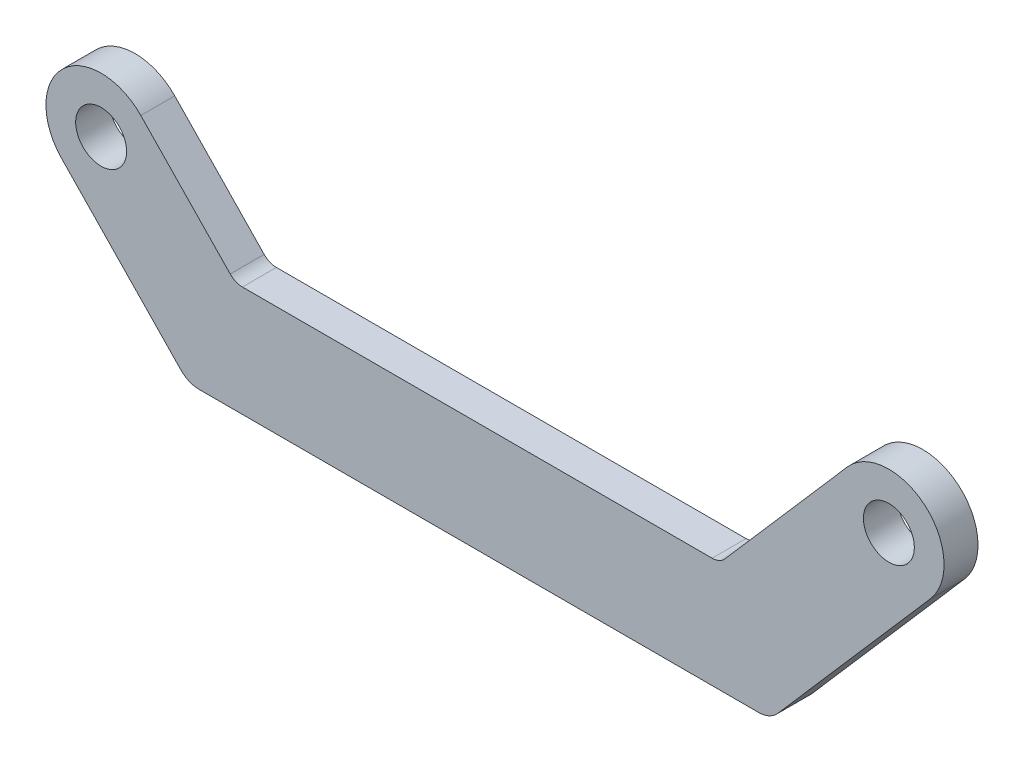
ISO-10303-21;
HEADER;
FILE_DESCRIPTION(('STEP AP214'),'2;1');
FILE_NAME('part.step','',(''),(''),'','','');
FILE_SCHEMA(('AUTOMOTIVE_DESIGN { 1 0 10303 214 1 1 1 1 }'));
ENDSEC;
DATA;
#1=APPLICATION_CONTEXT('core data for automotive mechanical design processes');
#2=APPLICATION_PROTOCOL_DEFINITION('international standard','automotive_design',2000,#1);
#3=PRODUCT_CONTEXT('',#1,'mechanical');
#4=PRODUCT('Part','Part','',(#3));
#5=PRODUCT_RELATED_PRODUCT_CATEGORY('part','',(#4));
#6=PRODUCT_DEFINITION_FORMATION('','',#4);
#7=PRODUCT_DEFINITION_CONTEXT('part definition',#1,'design');
#8=PRODUCT_DEFINITION('design','',#6,#7);
#9=PRODUCT_DEFINITION_SHAPE('','',#8);
#10=(LENGTH_UNIT() NAMED_UNIT(*) SI_UNIT(.MILLI.,.METRE.));
#11=(NAMED_UNIT(*) PLANE_ANGLE_UNIT() SI_UNIT($,.RADIAN.));
#12=(NAMED_UNIT(*) SI_UNIT($,.STERADIAN.) SOLID_ANGLE_UNIT());
#13=UNCERTAINTY_MEASURE_WITH_UNIT(LENGTH_MEASURE(1.E-05),#10,'distance_accuracy_value','');
#14=(GEOMETRIC_REPRESENTATION_CONTEXT(3) GLOBAL_UNCERTAINTY_ASSIGNED_CONTEXT((#13)) GLOBAL_UNIT_ASSIGNED_CONTEXT((#10,
#11,#12)) REPRESENTATION_CONTEXT('',''));
#15=CARTESIAN_POINT('',(0.,0.,0.));
#16=DIRECTION('',(0.,0.,1.));
#17=DIRECTION('',(1.,0.,0.));
#18=AXIS2_PLACEMENT_3D('',#15,#16,#17);
#19=CARTESIAN_POINT('',(92.8062497895481,6.,4.));
#20=DIRECTION('',(0.,0.,1.));
#21=DIRECTION('',(1.,0.,0.));
#22=AXIS2_PLACEMENT_3D('',#19,#20,#21);
#23=PLANE('',#22);
#24=CARTESIAN_POINT('',(0.,0.,4.));
#25=DIRECTION('',(0.,0.,1.));
#26=DIRECTION('',(1.,0.,0.));
#27=AXIS2_PLACEMENT_3D('',#24,#25,#26);
#28=CIRCLE('',#27,3.);
#29=CARTESIAN_POINT('',(3.,0.,4.));
#30=VERTEX_POINT('',#29);
#31=EDGE_CURVE('E143',#30,#30,#28,.T.);
#32=ORIENTED_EDGE('',*,*,#31,.F.);
#33=EDGE_LOOP('',(#32));
#34=FACE_BOUND('',#33,.T.);
#35=DIRECTION('',(0.694658370459001,-0.719339800338648,0.));
#36=VECTOR('',#35,1.);
#37=CARTESIAN_POINT('',(10.2777121545332,-20.,4.));
#38=LINE('',#37,#36);
#39=CARTESIAN_POINT('',(-4.67570870220121,-4.51527940798351,4.));
#40=VERTEX_POINT('',#39);
#41=CARTESIAN_POINT('',(9.39311720214609,-19.083975111377,4.));
#42=VERTEX_POINT('',#41);
#43=EDGE_CURVE('E174',#40,#42,#38,.T.);
#44=ORIENTED_EDGE('',*,*,#43,.T.);
#45=CARTESIAN_POINT('',(11.551136603162,-17.,4.));
#46=DIRECTION('',(0.,0.,1.));
#47=DIRECTION('',(1.,0.,0.));
#48=AXIS2_PLACEMENT_3D('',#45,#46,#47);
#49=CIRCLE('',#48,3.);
#50=CARTESIAN_POINT('',(11.551136603162,-20.,4.));
#51=VERTEX_POINT('',#50);
#52=EDGE_CURVE('E200',#42,#51,#49,.T.);
#53=ORIENTED_EDGE('',*,*,#52,.T.);
#54=DIRECTION('',(1.,0.,0.));
#55=VECTOR('',#54,1.);
#56=CARTESIAN_POINT('',(10.2777121545332,-20.,4.));
#57=LINE('',#56,#55);
#58=CARTESIAN_POINT('',(77.4502002964958,-20.,4.));
#59=VERTEX_POINT('',#58);
#60=EDGE_CURVE('E177',#51,#59,#57,.T.);
#61=ORIENTED_EDGE('',*,*,#60,.T.);
#62=CARTESIAN_POINT('',(77.4502002964958,-17.,4.));
#63=DIRECTION('',(0.,0.,1.));
#64=DIRECTION('',(1.,0.,0.));
#65=AXIS2_PLACEMENT_3D('',#62,#63,#64);
#66=CIRCLE('',#65,3.);
#67=CARTESIAN_POINT('',(79.7143290371641,-18.9681770869715,4.));
#68=VERTEX_POINT('',#67);
#69=EDGE_CURVE('E198',#59,#68,#66,.T.);
#70=ORIENTED_EDGE('',*,*,#69,.T.);
#71=DIRECTION('',(0.656059028990506,0.754709580222773,0.));
#72=VECTOR('',#71,1.);
#73=CARTESIAN_POINT('',(78.8173790630936,-20.,4.));
#74=LINE('',#73,#72);
#75=CARTESIAN_POINT('',(97.7118620609961,1.73561631156171,4.));
#76=VERTEX_POINT('',#75);
#77=EDGE_CURVE('E180',#68,#76,#74,.T.);
#78=ORIENTED_EDGE('',*,*,#77,.T.);
#79=CARTESIAN_POINT('',(92.8062497895481,6.,4.));
#80=DIRECTION('',(0.,0.,1.));
#81=DIRECTION('',(1.,0.,0.));
#82=AXIS2_PLACEMENT_3D('',#79,#80,#81);
#83=CIRCLE('',#82,6.49999999999999);
#84=CARTESIAN_POINT('',(87.9006375181001,10.2643836884383,4.));
#85=VERTEX_POINT('',#84);
#86=EDGE_CURVE('E164',#76,#85,#83,.T.);
#87=ORIENTED_EDGE('',*,*,#86,.T.);
#88=DIRECTION('',(-0.656059028990506,-0.754709580222773,0.));
#89=VECTOR('',#88,1.);
#90=CARTESIAN_POINT('',(72.89293774117,-7.,4.));
#91=LINE('',#90,#89);
#92=CARTESIAN_POINT('',(73.4909043905503,-6.31211805798101,4.));
#93=VERTEX_POINT('',#92);
#94=EDGE_CURVE('E133',#85,#93,#91,.T.);
#95=ORIENTED_EDGE('',*,*,#94,.T.);
#96=CARTESIAN_POINT('',(71.9814852301048,-5.,4.));
#97=DIRECTION('',(0.,0.,1.));
#98=DIRECTION('',(1.,0.,0.));
#99=AXIS2_PLACEMENT_3D('',#96,#97,#98);
#100=CIRCLE('',#99,2.);
#101=CARTESIAN_POINT('',(71.9814852301048,-7.,4.));
#102=VERTEX_POINT('',#101);
#103=EDGE_CURVE('E11',#93,#102,#100,.F.);
#104=ORIENTED_EDGE('',*,*,#103,.T.);
#105=DIRECTION('',(-1.,0.,0.));
#106=VECTOR('',#105,1.);
#107=CARTESIAN_POINT('',(15.795884765258,-7.,4.));
#108=LINE('',#107,#106);
#109=CARTESIAN_POINT('',(16.6448343976773,-7.,4.));
#110=VERTEX_POINT('',#109);
#111=EDGE_CURVE('E167',#102,#110,#108,.T.);
#112=ORIENTED_EDGE('',*,*,#111,.T.);
#113=CARTESIAN_POINT('',(16.6448343976773,-5.,4.));
#114=DIRECTION('',(0.,0.,1.));
#115=DIRECTION('',(1.,0.,0.));
#116=AXIS2_PLACEMENT_3D('',#113,#114,#115);
#117=CIRCLE('',#116,2.);
#118=CARTESIAN_POINT('',(15.206154797,-6.389316740918,4.));
#119=VERTEX_POINT('',#118);
#120=EDGE_CURVE('E216',#110,#119,#117,.F.);
#121=ORIENTED_EDGE('',*,*,#120,.T.);
#122=DIRECTION('',(-0.694658370459001,0.719339800338648,0.));
#123=VECTOR('',#122,1.);
#124=CARTESIAN_POINT('',(15.795884765258,-7.,4.));
#125=LINE('',#124,#123);
#126=CARTESIAN_POINT('',(4.67570870220121,4.51527940798351,4.));
#127=VERTEX_POINT('',#126);
#128=EDGE_CURVE('E170',#119,#127,#125,.T.);
#129=ORIENTED_EDGE('',*,*,#128,.T.);
#130=CARTESIAN_POINT('',(0.,0.,4.));
#131=DIRECTION('',(0.,0.,1.));
#132=DIRECTION('',(1.,0.,0.));
#133=AXIS2_PLACEMENT_3D('',#130,#131,#132);
#134=CIRCLE('',#133,6.5);
#135=EDGE_CURVE('E172',#127,#40,#134,.T.);
#136=ORIENTED_EDGE('',*,*,#135,.T.);
#137=EDGE_LOOP('',(#44,#53,#61,#70,#78,#87,#95,#104,#112,#121,#129,#136));
#138=FACE_BOUND('',#137,.T.);
#139=CARTESIAN_POINT('',(92.8062497895481,6.,4.));
#140=DIRECTION('',(0.,0.,1.));
#141=DIRECTION('',(1.,0.,0.));
#142=AXIS2_PLACEMENT_3D('',#139,#140,#141);
#143=CIRCLE('',#142,3.00000000000001);
#144=CARTESIAN_POINT('',(95.8062497895481,6.,4.));
#145=VERTEX_POINT('',#144);
#146=EDGE_CURVE('E428',#145,#145,#143,.T.);
#147=ORIENTED_EDGE('',*,*,#146,.F.);
#148=EDGE_LOOP('',(#147));
#149=FACE_BOUND('',#148,.T.);
#150=ADVANCED_FACE('F35',(#34,#138,#149),#23,.T.);
#151=CARTESIAN_POINT('',(92.8062497895481,6.,0.));
#152=DIRECTION('',(0.,0.,1.));
#153=DIRECTION('',(1.,0.,0.));
#154=AXIS2_PLACEMENT_3D('',#151,#152,#153);
#155=PLANE('',#154);
#156=CARTESIAN_POINT('',(0.,0.,0.));
#157=DIRECTION('',(0.,0.,1.));
#158=DIRECTION('',(1.,0.,0.));
#159=AXIS2_PLACEMENT_3D('',#156,#157,#158);
#160=CIRCLE('',#159,3.);
#161=CARTESIAN_POINT('',(3.,0.,0.));
#162=VERTEX_POINT('',#161);
#163=EDGE_CURVE('E146',#162,#162,#160,.T.);
#164=ORIENTED_EDGE('',*,*,#163,.T.);
#165=EDGE_LOOP('',(#164));
#166=FACE_BOUND('',#165,.T.);
#167=DIRECTION('',(1.,0.,0.));
#168=VECTOR('',#167,1.);
#169=CARTESIAN_POINT('',(10.2777121545332,-20.,0.));
#170=LINE('',#169,#168);
#171=CARTESIAN_POINT('',(11.551136603162,-20.,0.));
#172=VERTEX_POINT('',#171);
#173=CARTESIAN_POINT('',(77.4502002964958,-20.,0.));
#174=VERTEX_POINT('',#173);
#175=EDGE_CURVE('E159',#172,#174,#170,.T.);
#176=ORIENTED_EDGE('',*,*,#175,.F.);
#177=CARTESIAN_POINT('',(11.551136603162,-17.,0.));
#178=DIRECTION('',(0.,0.,1.));
#179=DIRECTION('',(1.,0.,0.));
#180=AXIS2_PLACEMENT_3D('',#177,#178,#179);
#181=CIRCLE('',#180,3.);
#182=CARTESIAN_POINT('',(9.39311720214609,-19.083975111377,0.));
#183=VERTEX_POINT('',#182);
#184=EDGE_CURVE('E194',#172,#183,#181,.F.);
#185=ORIENTED_EDGE('',*,*,#184,.T.);
#186=DIRECTION('',(0.694658370459001,-0.719339800338648,0.));
#187=VECTOR('',#186,1.);
#188=CARTESIAN_POINT('',(10.2777121545332,-20.,0.));
#189=LINE('',#188,#187);
#190=CARTESIAN_POINT('',(-4.67570870220121,-4.51527940798351,0.));
#191=VERTEX_POINT('',#190);
#192=EDGE_CURVE('E156',#191,#183,#189,.T.);
#193=ORIENTED_EDGE('',*,*,#192,.F.);
#194=CARTESIAN_POINT('',(0.,0.,0.));
#195=DIRECTION('',(0.,0.,1.));
#196=DIRECTION('',(1.,0.,0.));
#197=AXIS2_PLACEMENT_3D('',#194,#195,#196);
#198=CIRCLE('',#197,6.5);
#199=CARTESIAN_POINT('',(4.67570870220121,4.51527940798351,0.));
#200=VERTEX_POINT('',#199);
#201=EDGE_CURVE('E154',#200,#191,#198,.T.);
#202=ORIENTED_EDGE('',*,*,#201,.F.);
#203=DIRECTION('',(-0.694658370459001,0.719339800338648,0.));
#204=VECTOR('',#203,1.);
#205=CARTESIAN_POINT('',(15.795884765258,-7.,0.));
#206=LINE('',#205,#204);
#207=CARTESIAN_POINT('',(15.206154797,-6.389316740918,0.));
#208=VERTEX_POINT('',#207);
#209=EDGE_CURVE('E152',#208,#200,#206,.T.);
#210=ORIENTED_EDGE('',*,*,#209,.F.);
#211=CARTESIAN_POINT('',(16.6448343976773,-5.,0.));
#212=DIRECTION('',(0.,0.,1.));
#213=DIRECTION('',(1.,0.,0.));
#214=AXIS2_PLACEMENT_3D('',#211,#212,#213);
#215=CIRCLE('',#214,2.);
#216=CARTESIAN_POINT('',(16.6448343976773,-7.,0.));
#217=VERTEX_POINT('',#216);
#218=EDGE_CURVE('E214',#208,#217,#215,.T.);
#219=ORIENTED_EDGE('',*,*,#218,.T.);
#220=DIRECTION('',(-1.,0.,0.));
#221=VECTOR('',#220,1.);
#222=CARTESIAN_POINT('',(15.795884765258,-7.,0.));
#223=LINE('',#222,#221);
#224=CARTESIAN_POINT('',(71.9814852301048,-7.,0.));
#225=VERTEX_POINT('',#224);
#226=EDGE_CURVE('E128',#225,#217,#223,.T.);
#227=ORIENTED_EDGE('',*,*,#226,.F.);
#228=CARTESIAN_POINT('',(71.9814852301048,-5.,0.));
#229=DIRECTION('',(0.,0.,1.));
#230=DIRECTION('',(1.,0.,0.));
#231=AXIS2_PLACEMENT_3D('',#228,#229,#230);
#232=CIRCLE('',#231,2.);
#233=CARTESIAN_POINT('',(73.4909043905503,-6.31211805798101,0.));
#234=VERTEX_POINT('',#233);
#235=EDGE_CURVE('E43',#225,#234,#232,.T.);
#236=ORIENTED_EDGE('',*,*,#235,.T.);
#237=DIRECTION('',(-0.656059028990506,-0.754709580222773,0.));
#238=VECTOR('',#237,1.);
#239=CARTESIAN_POINT('',(72.89293774117,-7.,0.));
#240=LINE('',#239,#238);
#241=CARTESIAN_POINT('',(87.9006375181001,10.2643836884383,0.));
#242=VERTEX_POINT('',#241);
#243=EDGE_CURVE('E120',#242,#234,#240,.T.);
#244=ORIENTED_EDGE('',*,*,#243,.F.);
#245=CARTESIAN_POINT('',(92.8062497895481,6.,0.));
#246=DIRECTION('',(0.,0.,1.));
#247=DIRECTION('',(1.,0.,0.));
#248=AXIS2_PLACEMENT_3D('',#245,#246,#247);
#249=CIRCLE('',#248,6.49999999999999);
#250=CARTESIAN_POINT('',(97.7118620609961,1.73561631156171,0.));
#251=VERTEX_POINT('',#250);
#252=EDGE_CURVE('E127',#251,#242,#249,.T.);
#253=ORIENTED_EDGE('',*,*,#252,.F.);
#254=DIRECTION('',(0.656059028990506,0.754709580222773,0.));
#255=VECTOR('',#254,1.);
#256=CARTESIAN_POINT('',(78.8173790630936,-20.,0.));
#257=LINE('',#256,#255);
#258=CARTESIAN_POINT('',(79.7143290371641,-18.9681770869715,0.));
#259=VERTEX_POINT('',#258);
#260=EDGE_CURVE('E162',#259,#251,#257,.T.);
#261=ORIENTED_EDGE('',*,*,#260,.F.);
#262=CARTESIAN_POINT('',(77.4502002964958,-17.,0.));
#263=DIRECTION('',(0.,0.,1.));
#264=DIRECTION('',(1.,0.,0.));
#265=AXIS2_PLACEMENT_3D('',#262,#263,#264);
#266=CIRCLE('',#265,3.);
#267=EDGE_CURVE('E192',#259,#174,#266,.F.);
#268=ORIENTED_EDGE('',*,*,#267,.T.);
#269=EDGE_LOOP('',(#176,#185,#193,#202,#210,#219,#227,#236,#244,#253,#261,#268));
#270=FACE_BOUND('',#269,.T.);
#271=CARTESIAN_POINT('',(92.8062497895481,6.,0.));
#272=DIRECTION('',(0.,0.,1.));
#273=DIRECTION('',(1.,0.,0.));
#274=AXIS2_PLACEMENT_3D('',#271,#272,#273);
#275=CIRCLE('',#274,3.00000000000001);
#276=CARTESIAN_POINT('',(95.8062497895481,6.,0.));
#277=VERTEX_POINT('',#276);
#278=EDGE_CURVE('E431',#277,#277,#275,.T.);
#279=ORIENTED_EDGE('',*,*,#278,.T.);
#280=EDGE_LOOP('',(#279));
#281=FACE_BOUND('',#280,.T.);
#282=ADVANCED_FACE('F123',(#166,#270,#281),#155,.F.);
#283=CARTESIAN_POINT('',(92.8062497895481,6.,4.));
#284=DIRECTION('',(0.,0.,-1.));
#285=DIRECTION('',(-1.,0.,0.));
#286=AXIS2_PLACEMENT_3D('',#283,#284,#285);
#287=CYLINDRICAL_SURFACE('',#286,6.49999999999999);
#288=ORIENTED_EDGE('',*,*,#252,.T.);
#289=DIRECTION('',(0.,0.,-1.));
#290=VECTOR('',#289,1.);
#291=CARTESIAN_POINT('',(87.9006375181001,10.2643836884383,4.));
#292=LINE('',#291,#290);
#293=EDGE_CURVE('E131',#85,#242,#292,.T.);
#294=ORIENTED_EDGE('',*,*,#293,.F.);
#295=ORIENTED_EDGE('',*,*,#86,.F.);
#296=DIRECTION('',(0.,0.,-1.));
#297=VECTOR('',#296,1.);
#298=CARTESIAN_POINT('',(97.7118620609961,1.73561631156171,4.));
#299=LINE('',#298,#297);
#300=EDGE_CURVE('E142',#76,#251,#299,.T.);
#301=ORIENTED_EDGE('',*,*,#300,.T.);
#302=EDGE_LOOP('',(#288,#294,#295,#301));
#303=FACE_BOUND('',#302,.T.);
#304=ADVANCED_FACE('F37',(#303),#287,.T.);
#305=CARTESIAN_POINT('',(72.89293774117,-7.,4.));
#306=DIRECTION('',(0.754709580222773,-0.656059028990506,0.));
#307=DIRECTION('',(0.656059028990506,0.754709580222773,0.));
#308=AXIS2_PLACEMENT_3D('',#305,#306,#307);
#309=PLANE('',#308);
#310=ORIENTED_EDGE('',*,*,#243,.T.);
#311=DIRECTION('',(0.,0.,-1.));
#312=VECTOR('',#311,1.);
#313=CARTESIAN_POINT('',(73.4909043905503,-6.31211805798101,4.));
#314=LINE('',#313,#312);
#315=EDGE_CURVE('E50',#234,#93,#314,.F.);
#316=ORIENTED_EDGE('',*,*,#315,.T.);
#317=ORIENTED_EDGE('',*,*,#94,.F.);
#318=ORIENTED_EDGE('',*,*,#293,.T.);
#319=EDGE_LOOP('',(#310,#316,#317,#318));
#320=FACE_BOUND('',#319,.T.);
#321=ADVANCED_FACE('F132',(#320),#309,.F.);
#322=CARTESIAN_POINT('',(15.795884765258,-7.,4.));
#323=DIRECTION('',(0.,-1.,0.));
#324=DIRECTION('',(0.,0.,-1.));
#325=AXIS2_PLACEMENT_3D('',#322,#323,#324);
#326=PLANE('',#325);
#327=ORIENTED_EDGE('',*,*,#226,.T.);
#328=DIRECTION('',(0.,0.,-1.));
#329=VECTOR('',#328,1.);
#330=CARTESIAN_POINT('',(16.6448343976773,-7.,4.));
#331=LINE('',#330,#329);
#332=EDGE_CURVE('E211',#217,#110,#331,.F.);
#333=ORIENTED_EDGE('',*,*,#332,.T.);
#334=ORIENTED_EDGE('',*,*,#111,.F.);
#335=DIRECTION('',(0.,0.,-1.));
#336=VECTOR('',#335,1.);
#337=CARTESIAN_POINT('',(71.9814852301048,-7.,0.));
#338=LINE('',#337,#336);
#339=EDGE_CURVE('E208',#102,#225,#338,.T.);
#340=ORIENTED_EDGE('',*,*,#339,.T.);
#341=EDGE_LOOP('',(#327,#333,#334,#340));
#342=FACE_BOUND('',#341,.T.);
#343=ADVANCED_FACE('F233',(#342),#326,.F.);
#344=CARTESIAN_POINT('',(15.795884765258,-7.,4.));
#345=DIRECTION('',(-0.719339800338648,-0.694658370459001,0.));
#346=DIRECTION('',(0.694658370459001,-0.719339800338648,0.));
#347=AXIS2_PLACEMENT_3D('',#344,#345,#346);
#348=PLANE('',#347);
#349=ORIENTED_EDGE('',*,*,#128,.F.);
#350=DIRECTION('',(0.,0.,-1.));
#351=VECTOR('',#350,1.);
#352=CARTESIAN_POINT('',(15.206154797,-6.389316740918,0.));
#353=LINE('',#352,#351);
#354=EDGE_CURVE('E205',#119,#208,#353,.T.);
#355=ORIENTED_EDGE('',*,*,#354,.T.);
#356=ORIENTED_EDGE('',*,*,#209,.T.);
#357=DIRECTION('',(0.,0.,-1.));
#358=VECTOR('',#357,1.);
#359=CARTESIAN_POINT('',(4.67570870220121,4.51527940798351,4.));
#360=LINE('',#359,#358);
#361=EDGE_CURVE('E138',#127,#200,#360,.T.);
#362=ORIENTED_EDGE('',*,*,#361,.F.);
#363=EDGE_LOOP('',(#349,#355,#356,#362));
#364=FACE_BOUND('',#363,.T.);
#365=ADVANCED_FACE('F227',(#364),#348,.F.);
#366=CARTESIAN_POINT('',(0.,0.,4.));
#367=DIRECTION('',(0.,0.,-1.));
#368=DIRECTION('',(-1.,0.,0.));
#369=AXIS2_PLACEMENT_3D('',#366,#367,#368);
#370=CYLINDRICAL_SURFACE('',#369,6.5);
#371=ORIENTED_EDGE('',*,*,#201,.T.);
#372=DIRECTION('',(0.,0.,-1.));
#373=VECTOR('',#372,1.);
#374=CARTESIAN_POINT('',(-4.67570870220121,-4.51527940798351,4.));
#375=LINE('',#374,#373);
#376=EDGE_CURVE('E183',#40,#191,#375,.T.);
#377=ORIENTED_EDGE('',*,*,#376,.F.);
#378=ORIENTED_EDGE('',*,*,#135,.F.);
#379=ORIENTED_EDGE('',*,*,#361,.T.);
#380=EDGE_LOOP('',(#371,#377,#378,#379));
#381=FACE_BOUND('',#380,.T.);
#382=ADVANCED_FACE('F280',(#381),#370,.T.);
#383=CARTESIAN_POINT('',(10.2777121545332,-20.,4.));
#384=DIRECTION('',(0.719339800338647,0.694658370459001,0.));
#385=DIRECTION('',(-0.694658370459001,0.719339800338648,0.));
#386=AXIS2_PLACEMENT_3D('',#383,#384,#385);
#387=PLANE('',#386);
#388=ORIENTED_EDGE('',*,*,#192,.T.);
#389=DIRECTION('',(0.,0.,-1.));
#390=VECTOR('',#389,1.);
#391=CARTESIAN_POINT('',(9.39311720214609,-19.083975111377,4.));
#392=LINE('',#391,#390);
#393=EDGE_CURVE('E196',#183,#42,#392,.F.);
#394=ORIENTED_EDGE('',*,*,#393,.T.);
#395=ORIENTED_EDGE('',*,*,#43,.F.);
#396=ORIENTED_EDGE('',*,*,#376,.T.);
#397=EDGE_LOOP('',(#388,#394,#395,#396));
#398=FACE_BOUND('',#397,.T.);
#399=ADVANCED_FACE('F277',(#398),#387,.F.);
#400=CARTESIAN_POINT('',(10.2777121545332,-20.,4.));
#401=DIRECTION('',(0.,1.,0.));
#402=DIRECTION('',(0.,0.,1.));
#403=AXIS2_PLACEMENT_3D('',#400,#401,#402);
#404=PLANE('',#403);
#405=ORIENTED_EDGE('',*,*,#60,.F.);
#406=DIRECTION('',(0.,0.,-1.));
#407=VECTOR('',#406,1.);
#408=CARTESIAN_POINT('',(11.551136603162,-20.,4.));
#409=LINE('',#408,#407);
#410=EDGE_CURVE('E189',#51,#172,#409,.T.);
#411=ORIENTED_EDGE('',*,*,#410,.T.);
#412=ORIENTED_EDGE('',*,*,#175,.T.);
#413=DIRECTION('',(0.,0.,-1.));
#414=VECTOR('',#413,1.);
#415=CARTESIAN_POINT('',(77.4502002964958,-20.,4.));
#416=LINE('',#415,#414);
#417=EDGE_CURVE('E137',#174,#59,#416,.F.);
#418=ORIENTED_EDGE('',*,*,#417,.T.);
#419=EDGE_LOOP('',(#405,#411,#412,#418));
#420=FACE_BOUND('',#419,.T.);
#421=ADVANCED_FACE('F247',(#420),#404,.F.);
#422=CARTESIAN_POINT('',(78.8173790630936,-20.,4.));
#423=DIRECTION('',(-0.754709580222773,0.656059028990506,0.));
#424=DIRECTION('',(-0.656059028990506,-0.754709580222773,0.));
#425=AXIS2_PLACEMENT_3D('',#422,#423,#424);
#426=PLANE('',#425);
#427=ORIENTED_EDGE('',*,*,#77,.F.);
#428=DIRECTION('',(0.,0.,-1.));
#429=VECTOR('',#428,1.);
#430=CARTESIAN_POINT('',(79.7143290371641,-18.9681770869715,4.));
#431=LINE('',#430,#429);
#432=EDGE_CURVE('E202',#68,#259,#431,.T.);
#433=ORIENTED_EDGE('',*,*,#432,.T.);
#434=ORIENTED_EDGE('',*,*,#260,.T.);
#435=ORIENTED_EDGE('',*,*,#300,.F.);
#436=EDGE_LOOP('',(#427,#433,#434,#435));
#437=FACE_BOUND('',#436,.T.);
#438=ADVANCED_FACE('F242',(#437),#426,.F.);
#439=CARTESIAN_POINT('',(0.,0.,4.));
#440=DIRECTION('',(0.,0.,-1.));
#441=DIRECTION('',(-1.,0.,0.));
#442=AXIS2_PLACEMENT_3D('',#439,#440,#441);
#443=CYLINDRICAL_SURFACE('',#442,3.);
#444=ORIENTED_EDGE('',*,*,#31,.T.);
#445=EDGE_LOOP('',(#444));
#446=FACE_BOUND('',#445,.T.);
#447=ORIENTED_EDGE('',*,*,#163,.F.);
#448=EDGE_LOOP('',(#447));
#449=FACE_BOUND('',#448,.T.);
#450=ADVANCED_FACE('F274',(#446,#449),#443,.F.);
#451=CARTESIAN_POINT('',(92.8062497895481,6.,4.));
#452=DIRECTION('',(0.,0.,-1.));
#453=DIRECTION('',(-1.,0.,0.));
#454=AXIS2_PLACEMENT_3D('',#451,#452,#453);
#455=CYLINDRICAL_SURFACE('',#454,3.00000000000001);
#456=ORIENTED_EDGE('',*,*,#146,.T.);
#457=EDGE_LOOP('',(#456));
#458=FACE_BOUND('',#457,.T.);
#459=ORIENTED_EDGE('',*,*,#278,.F.);
#460=EDGE_LOOP('',(#459));
#461=FACE_BOUND('',#460,.T.);
#462=ADVANCED_FACE('F258',(#458,#461),#455,.F.);
#463=CARTESIAN_POINT('',(11.551136603162,-17.,4.));
#464=DIRECTION('',(0.,0.,-1.));
#465=DIRECTION('',(-1.,0.,0.));
#466=AXIS2_PLACEMENT_3D('',#463,#464,#465);
#467=CYLINDRICAL_SURFACE('',#466,3.);
#468=ORIENTED_EDGE('',*,*,#52,.F.);
#469=ORIENTED_EDGE('',*,*,#393,.F.);
#470=ORIENTED_EDGE('',*,*,#184,.F.);
#471=ORIENTED_EDGE('',*,*,#410,.F.);
#472=EDGE_LOOP('',(#468,#469,#470,#471));
#473=FACE_BOUND('',#472,.T.);
#474=ADVANCED_FACE('F251',(#473),#467,.T.);
#475=CARTESIAN_POINT('',(77.4502002964958,-17.,4.));
#476=DIRECTION('',(0.,0.,-1.));
#477=DIRECTION('',(-1.,0.,0.));
#478=AXIS2_PLACEMENT_3D('',#475,#476,#477);
#479=CYLINDRICAL_SURFACE('',#478,3.);
#480=ORIENTED_EDGE('',*,*,#69,.F.);
#481=ORIENTED_EDGE('',*,*,#417,.F.);
#482=ORIENTED_EDGE('',*,*,#267,.F.);
#483=ORIENTED_EDGE('',*,*,#432,.F.);
#484=EDGE_LOOP('',(#480,#481,#482,#483));
#485=FACE_BOUND('',#484,.T.);
#486=ADVANCED_FACE('F249',(#485),#479,.T.);
#487=CARTESIAN_POINT('',(16.6448343976773,-5.,4.));
#488=DIRECTION('',(0.,0.,1.));
#489=DIRECTION('',(1.,0.,0.));
#490=AXIS2_PLACEMENT_3D('',#487,#488,#489);
#491=CYLINDRICAL_SURFACE('',#490,2.);
#492=ORIENTED_EDGE('',*,*,#120,.F.);
#493=ORIENTED_EDGE('',*,*,#332,.F.);
#494=ORIENTED_EDGE('',*,*,#218,.F.);
#495=ORIENTED_EDGE('',*,*,#354,.F.);
#496=EDGE_LOOP('',(#492,#493,#494,#495));
#497=FACE_BOUND('',#496,.T.);
#498=ADVANCED_FACE('F230',(#497),#491,.F.);
#499=CARTESIAN_POINT('',(71.9814852301048,-5.,4.));
#500=DIRECTION('',(0.,0.,1.));
#501=DIRECTION('',(1.,0.,0.));
#502=AXIS2_PLACEMENT_3D('',#499,#500,#501);
#503=CYLINDRICAL_SURFACE('',#502,2.);
#504=ORIENTED_EDGE('',*,*,#103,.F.);
#505=ORIENTED_EDGE('',*,*,#315,.F.);
#506=ORIENTED_EDGE('',*,*,#235,.F.);
#507=ORIENTED_EDGE('',*,*,#339,.F.);
#508=EDGE_LOOP('',(#504,#505,#506,#507));
#509=FACE_BOUND('',#508,.T.);
#510=ADVANCED_FACE('F237',(#509),#503,.F.);
#511=CLOSED_SHELL('',(#150,#282,#304,#321,#343,#365,#382,#399,#421,#438,#450,#462,#474,#486,
#498,#510));
#512=MANIFOLD_SOLID_BREP('B2',#511);
#513=ADVANCED_BREP_SHAPE_REPRESENTATION('',(#18,#512),#14);
#514=SHAPE_DEFINITION_REPRESENTATION(#9,#513);
ENDSEC;
END-ISO-10303-21;
